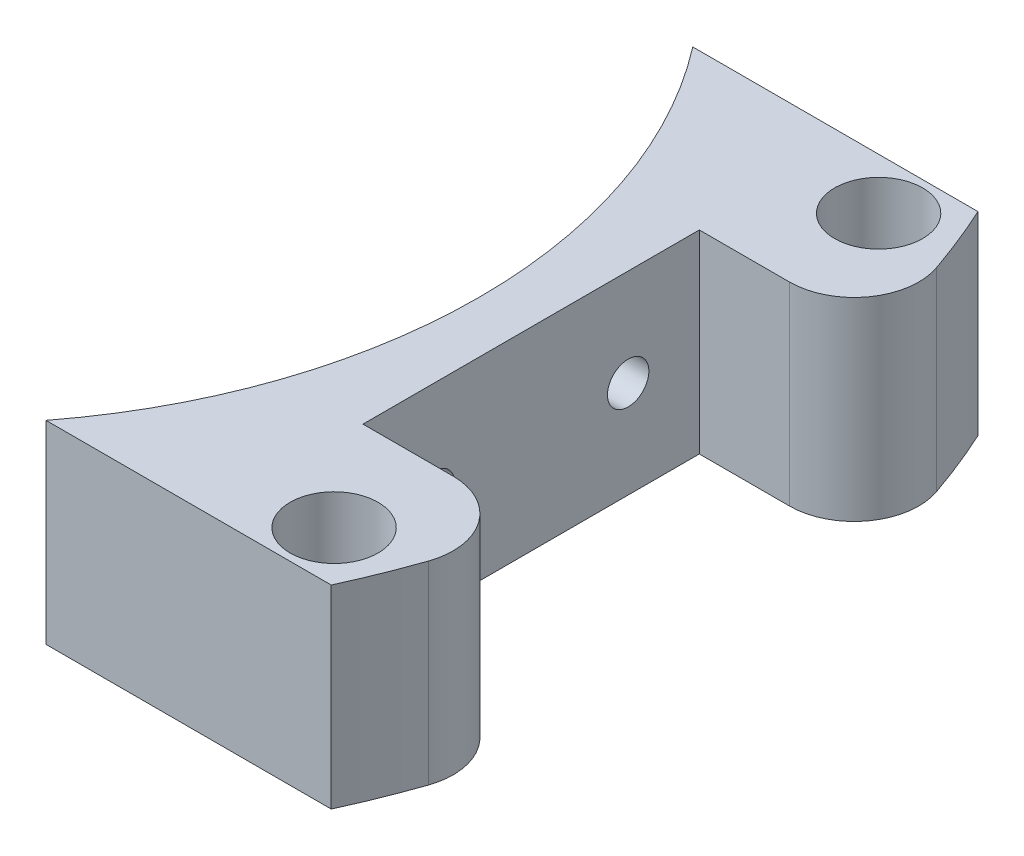
ISO-10303-21;
HEADER;
FILE_DESCRIPTION(('STEP AP214'),'2;1');
FILE_NAME('part.step','',(''),(''),'','','');
FILE_SCHEMA(('AUTOMOTIVE_DESIGN { 1 0 10303 214 1 1 1 1 }'));
ENDSEC;
DATA;
#1=APPLICATION_CONTEXT('core data for automotive mechanical design processes');
#2=APPLICATION_PROTOCOL_DEFINITION('international standard','automotive_design',2000,#1);
#3=PRODUCT_CONTEXT('',#1,'mechanical');
#4=PRODUCT('Part','Part','',(#3));
#5=PRODUCT_RELATED_PRODUCT_CATEGORY('part','',(#4));
#6=PRODUCT_DEFINITION_FORMATION('','',#4);
#7=PRODUCT_DEFINITION_CONTEXT('part definition',#1,'design');
#8=PRODUCT_DEFINITION('design','',#6,#7);
#9=PRODUCT_DEFINITION_SHAPE('','',#8);
#10=(LENGTH_UNIT() NAMED_UNIT(*) SI_UNIT(.MILLI.,.METRE.));
#11=(NAMED_UNIT(*) PLANE_ANGLE_UNIT() SI_UNIT($,.RADIAN.));
#12=(NAMED_UNIT(*) SI_UNIT($,.STERADIAN.) SOLID_ANGLE_UNIT());
#13=UNCERTAINTY_MEASURE_WITH_UNIT(LENGTH_MEASURE(1.E-05),#10,'distance_accuracy_value','');
#14=(GEOMETRIC_REPRESENTATION_CONTEXT(3) GLOBAL_UNCERTAINTY_ASSIGNED_CONTEXT((#13)) GLOBAL_UNIT_ASSIGNED_CONTEXT((#10,
#11,#12)) REPRESENTATION_CONTEXT('',''));
#15=CARTESIAN_POINT('',(0.,0.,0.));
#16=DIRECTION('',(0.,0.,1.));
#17=DIRECTION('',(1.,0.,0.));
#18=AXIS2_PLACEMENT_3D('',#15,#16,#17);
#19=CARTESIAN_POINT('',(-7.95357838980362,7.5,-68.2096969177125));
#20=DIRECTION('',(1.,0.,0.));
#21=DIRECTION('',(0.,0.,-1.));
#22=AXIS2_PLACEMENT_3D('',#19,#20,#21);
#23=CYLINDRICAL_SURFACE('',#22,1.6);
#24=CARTESIAN_POINT('',(4.55026799165255,7.5,-68.2096969177125));
#25=DIRECTION('',(1.,0.,0.));
#26=DIRECTION('',(0.,0.,-1.));
#27=AXIS2_PLACEMENT_3D('',#24,#25,#26);
#28=CIRCLE('',#27,1.6);
#29=CARTESIAN_POINT('',(4.55026799165255,7.5,-69.8096969177125));
#30=VERTEX_POINT('',#29);
#31=EDGE_CURVE('E377',#30,#30,#28,.T.);
#32=CARTESIAN_POINT('',(2.04642161019638,7.5,-68.2096969177125));
#33=DIRECTION('',(-1.,0.,0.));
#34=DIRECTION('',(0.,0.,1.));
#35=AXIS2_PLACEMENT_3D('',#32,#33,#34);
#36=CIRCLE('',#35,1.6);
#37=CARTESIAN_POINT('',(2.04642161019638,7.5,-69.8096969177125));
#38=VERTEX_POINT('',#37);
#39=EDGE_CURVE('E363',#38,#38,#36,.T.);
#40=CARTESIAN_POINT('',(4.55026799165255,7.5,-69.8096969177125));
#41=CARTESIAN_POINT('',(4.52418625851238,7.5,-69.8096969177125));
#42=CARTESIAN_POINT('',(4.49810452537221,7.5,-69.8096969177125));
#43=CARTESIAN_POINT('',(4.44594105909187,7.5,-69.8096969177125));
#44=CARTESIAN_POINT('',(4.4198593259517,7.5,-69.8096969177125));
#45=CARTESIAN_POINT('',(4.36769585967137,7.5,-69.8096969177125));
#46=CARTESIAN_POINT('',(4.3416141265312,7.5,-69.8096969177125));
#47=CARTESIAN_POINT('',(4.28945066025086,7.5,-69.8096969177125));
#48=CARTESIAN_POINT('',(4.26336892711069,7.5,-69.8096969177125));
#49=CARTESIAN_POINT('',(4.21120546083036,7.5,-69.8096969177125));
#50=CARTESIAN_POINT('',(4.18512372769019,7.5,-69.8096969177125));
#51=CARTESIAN_POINT('',(4.13296026140985,7.5,-69.8096969177125));
#52=CARTESIAN_POINT('',(4.10687852826968,7.5,-69.8096969177125));
#53=CARTESIAN_POINT('',(4.05471506198935,7.5,-69.8096969177125));
#54=CARTESIAN_POINT('',(4.02863332884918,7.5,-69.8096969177125));
#55=CARTESIAN_POINT('',(3.97646986256884,7.5,-69.8096969177125));
#56=CARTESIAN_POINT('',(3.95038812942867,7.5,-69.8096969177125));
#57=CARTESIAN_POINT('',(3.89822466314834,7.5,-69.8096969177125));
#58=CARTESIAN_POINT('',(3.87214293000817,7.5,-69.8096969177125));
#59=CARTESIAN_POINT('',(3.81997946372783,7.5,-69.8096969177125));
#60=CARTESIAN_POINT('',(3.79389773058766,7.5,-69.8096969177125));
#61=CARTESIAN_POINT('',(3.74173426430732,7.5,-69.8096969177125));
#62=CARTESIAN_POINT('',(3.71565253116716,7.5,-69.8096969177125));
#63=CARTESIAN_POINT('',(3.66348906488682,7.5,-69.8096969177125));
#64=CARTESIAN_POINT('',(3.63740733174665,7.5,-69.8096969177125));
#65=CARTESIAN_POINT('',(3.58524386546632,7.5,-69.8096969177125));
#66=CARTESIAN_POINT('',(3.55916213232615,7.5,-69.8096969177125));
#67=CARTESIAN_POINT('',(3.50699866604581,7.5,-69.8096969177125));
#68=CARTESIAN_POINT('',(3.48091693290564,7.5,-69.8096969177125));
#69=CARTESIAN_POINT('',(3.4287534666253,7.5,-69.8096969177125));
#70=CARTESIAN_POINT('',(3.40267173348514,7.5,-69.8096969177125));
#71=CARTESIAN_POINT('',(3.3505082672048,7.5,-69.8096969177125));
#72=CARTESIAN_POINT('',(3.32442653406463,7.5,-69.8096969177125));
#73=CARTESIAN_POINT('',(3.27226306778429,7.5,-69.8096969177125));
#74=CARTESIAN_POINT('',(3.24618133464413,7.5,-69.8096969177125));
#75=CARTESIAN_POINT('',(3.19401786836379,7.5,-69.8096969177125));
#76=CARTESIAN_POINT('',(3.16793613522362,7.5,-69.8096969177125));
#77=CARTESIAN_POINT('',(3.11577266894328,7.5,-69.8096969177125));
#78=CARTESIAN_POINT('',(3.08969093580311,7.5,-69.8096969177125));
#79=CARTESIAN_POINT('',(3.03752746952278,7.5,-69.8096969177125));
#80=CARTESIAN_POINT('',(3.01144573638261,7.5,-69.8096969177125));
#81=CARTESIAN_POINT('',(2.95928227010227,7.5,-69.8096969177125));
#82=CARTESIAN_POINT('',(2.9332005369621,7.5,-69.8096969177125));
#83=CARTESIAN_POINT('',(2.88103707068177,7.5,-69.8096969177125));
#84=CARTESIAN_POINT('',(2.8549553375416,7.5,-69.8096969177125));
#85=CARTESIAN_POINT('',(2.80279187126126,7.5,-69.8096969177125));
#86=CARTESIAN_POINT('',(2.77671013812109,7.5,-69.8096969177125));
#87=CARTESIAN_POINT('',(2.72454667184076,7.5,-69.8096969177125));
#88=CARTESIAN_POINT('',(2.69846493870059,7.5,-69.8096969177125));
#89=CARTESIAN_POINT('',(2.64630147242025,7.5,-69.8096969177125));
#90=CARTESIAN_POINT('',(2.62021973928008,7.5,-69.8096969177125));
#91=CARTESIAN_POINT('',(2.56805627299975,7.5,-69.8096969177125));
#92=CARTESIAN_POINT('',(2.54197453985958,7.5,-69.8096969177125));
#93=CARTESIAN_POINT('',(2.48981107357924,7.5,-69.8096969177125));
#94=CARTESIAN_POINT('',(2.46372934043907,7.5,-69.8096969177125));
#95=CARTESIAN_POINT('',(2.41156587415874,7.5,-69.8096969177125));
#96=CARTESIAN_POINT('',(2.38548414101857,7.5,-69.8096969177125));
#97=CARTESIAN_POINT('',(2.33332067473823,7.5,-69.8096969177125));
#98=CARTESIAN_POINT('',(2.30723894159806,7.5,-69.8096969177125));
#99=CARTESIAN_POINT('',(2.25507547531773,7.5,-69.8096969177125));
#100=CARTESIAN_POINT('',(2.22899374217756,7.5,-69.8096969177125));
#101=CARTESIAN_POINT('',(2.17683027589722,7.5,-69.8096969177125));
#102=CARTESIAN_POINT('',(2.15074854275705,7.5,-69.8096969177125));
#103=CARTESIAN_POINT('',(2.09858507647671,7.5,-69.8096969177125));
#104=CARTESIAN_POINT('',(2.07250334333655,7.5,-69.8096969177125));
#105=CARTESIAN_POINT('',(2.04642161019638,7.5,-69.8096969177125));
#106=B_SPLINE_CURVE_WITH_KNOTS('',3,(#40,#41,#42,#43,#44,#45,#46,#47,#48,#49,#50,#51,#52,#53,
#54,#55,#56,#57,#58,#59,#60,#61,#62,#63,#64,#65,#66,#67,#68,#69,#70,#71,#72,#73,#74,#75,#76,#77,
#78,#79,#80,#81,#82,#83,#84,#85,#86,#87,#88,#89,#90,#91,#92,#93,#94,#95,#96,#97,#98,#99,#100,
#101,#102,#103,#104,#105),.UNSPECIFIED.,.F.,.F.,(4,2,2,2,2,2,2,2,2,2,2,2,2,2,2,2,2,2,2,2,2,2,2,
2,2,2,2,2,2,2,2,2,4),(0.,0.0782451994205055,0.156490398841011,0.234735598261517,
0.312980797682022,0.391225997102526,0.469471196523031,0.547716395943537,0.625961595364042,
0.704206794784548,0.782451994205053,0.860697193625559,0.938942393046063,1.01718759246657,
1.09543279188707,1.17367799130758,1.25192319072808,1.33016839014859,1.4084135895691,
1.4866587889896,1.56490398841011,1.64314918783061,1.72139438725112,1.79963958667162,
1.87788478609213,1.95612998551263,2.03437518493314,2.11262038435364,2.19086558377415,
2.26911078319465,2.34735598261516,2.42560118203566,2.50384638145617),.UNSPECIFIED.);
#107=EDGE_CURVE('BSEAM49',#30,#38,#106,.T.);
#108=ORIENTED_EDGE('',*,*,#31,.T.);
#109=ORIENTED_EDGE('',*,*,#39,.T.);
#110=ORIENTED_EDGE('',*,*,#107,.T.);
#111=ORIENTED_EDGE('',*,*,#107,.F.);
#112=EDGE_LOOP('',(#108,#110,#109,#111));
#113=FACE_BOUND('',#112,.T.);
#114=ADVANCED_FACE('F49',(#113),#23,.F.);
#115=CARTESIAN_POINT('',(-7.95357838980362,7.5,-83.2096969177125));
#116=DIRECTION('',(1.,0.,0.));
#117=DIRECTION('',(0.,0.,-1.));
#118=AXIS2_PLACEMENT_3D('',#115,#116,#117);
#119=CYLINDRICAL_SURFACE('',#118,1.6);
#120=CARTESIAN_POINT('',(4.55026799165254,7.5,-83.2096969177125));
#121=DIRECTION('',(1.,0.,0.));
#122=DIRECTION('',(0.,0.,-1.));
#123=AXIS2_PLACEMENT_3D('',#120,#121,#122);
#124=CIRCLE('',#123,1.6);
#125=CARTESIAN_POINT('',(4.55026799165254,7.5,-84.8096969177125));
#126=VERTEX_POINT('',#125);
#127=EDGE_CURVE('E167',#126,#126,#124,.T.);
#128=CARTESIAN_POINT('',(2.04642161019638,7.5,-83.2096969177125));
#129=DIRECTION('',(-1.,0.,0.));
#130=DIRECTION('',(0.,0.,1.));
#131=AXIS2_PLACEMENT_3D('',#128,#129,#130);
#132=CIRCLE('',#131,1.6);
#133=CARTESIAN_POINT('',(2.04642161019638,7.5,-84.8096969177125));
#134=VERTEX_POINT('',#133);
#135=EDGE_CURVE('E366',#134,#134,#132,.T.);
#136=CARTESIAN_POINT('',(4.55026799165254,7.5,-84.8096969177125));
#137=CARTESIAN_POINT('',(4.52418625851238,7.5,-84.8096969177125));
#138=CARTESIAN_POINT('',(4.49810452537221,7.5,-84.8096969177125));
#139=CARTESIAN_POINT('',(4.44594105909187,7.5,-84.8096969177125));
#140=CARTESIAN_POINT('',(4.4198593259517,7.5,-84.8096969177125));
#141=CARTESIAN_POINT('',(4.36769585967137,7.5,-84.8096969177125));
#142=CARTESIAN_POINT('',(4.3416141265312,7.5,-84.8096969177125));
#143=CARTESIAN_POINT('',(4.28945066025086,7.5,-84.8096969177125));
#144=CARTESIAN_POINT('',(4.26336892711069,7.5,-84.8096969177125));
#145=CARTESIAN_POINT('',(4.21120546083036,7.5,-84.8096969177125));
#146=CARTESIAN_POINT('',(4.18512372769019,7.5,-84.8096969177125));
#147=CARTESIAN_POINT('',(4.13296026140985,7.5,-84.8096969177125));
#148=CARTESIAN_POINT('',(4.10687852826968,7.5,-84.8096969177125));
#149=CARTESIAN_POINT('',(4.05471506198935,7.5,-84.8096969177125));
#150=CARTESIAN_POINT('',(4.02863332884918,7.5,-84.8096969177125));
#151=CARTESIAN_POINT('',(3.97646986256884,7.5,-84.8096969177125));
#152=CARTESIAN_POINT('',(3.95038812942867,7.5,-84.8096969177125));
#153=CARTESIAN_POINT('',(3.89822466314834,7.5,-84.8096969177125));
#154=CARTESIAN_POINT('',(3.87214293000817,7.5,-84.8096969177125));
#155=CARTESIAN_POINT('',(3.81997946372783,7.5,-84.8096969177125));
#156=CARTESIAN_POINT('',(3.79389773058766,7.5,-84.8096969177125));
#157=CARTESIAN_POINT('',(3.74173426430732,7.5,-84.8096969177125));
#158=CARTESIAN_POINT('',(3.71565253116716,7.5,-84.8096969177125));
#159=CARTESIAN_POINT('',(3.66348906488682,7.5,-84.8096969177125));
#160=CARTESIAN_POINT('',(3.63740733174665,7.5,-84.8096969177125));
#161=CARTESIAN_POINT('',(3.58524386546631,7.5,-84.8096969177125));
#162=CARTESIAN_POINT('',(3.55916213232615,7.5,-84.8096969177125));
#163=CARTESIAN_POINT('',(3.50699866604581,7.5,-84.8096969177125));
#164=CARTESIAN_POINT('',(3.48091693290564,7.5,-84.8096969177125));
#165=CARTESIAN_POINT('',(3.4287534666253,7.5,-84.8096969177125));
#166=CARTESIAN_POINT('',(3.40267173348514,7.5,-84.8096969177125));
#167=CARTESIAN_POINT('',(3.3505082672048,7.5,-84.8096969177125));
#168=CARTESIAN_POINT('',(3.32442653406463,7.5,-84.8096969177125));
#169=CARTESIAN_POINT('',(3.27226306778429,7.5,-84.8096969177125));
#170=CARTESIAN_POINT('',(3.24618133464413,7.5,-84.8096969177125));
#171=CARTESIAN_POINT('',(3.19401786836379,7.5,-84.8096969177125));
#172=CARTESIAN_POINT('',(3.16793613522362,7.5,-84.8096969177125));
#173=CARTESIAN_POINT('',(3.11577266894328,7.5,-84.8096969177125));
#174=CARTESIAN_POINT('',(3.08969093580312,7.5,-84.8096969177125));
#175=CARTESIAN_POINT('',(3.03752746952278,7.5,-84.8096969177125));
#176=CARTESIAN_POINT('',(3.01144573638261,7.5,-84.8096969177125));
#177=CARTESIAN_POINT('',(2.95928227010227,7.5,-84.8096969177125));
#178=CARTESIAN_POINT('',(2.9332005369621,7.5,-84.8096969177125));
#179=CARTESIAN_POINT('',(2.88103707068177,7.5,-84.8096969177125));
#180=CARTESIAN_POINT('',(2.8549553375416,7.5,-84.8096969177125));
#181=CARTESIAN_POINT('',(2.80279187126126,7.5,-84.8096969177125));
#182=CARTESIAN_POINT('',(2.77671013812109,7.5,-84.8096969177125));
#183=CARTESIAN_POINT('',(2.72454667184076,7.5,-84.8096969177125));
#184=CARTESIAN_POINT('',(2.69846493870059,7.5,-84.8096969177125));
#185=CARTESIAN_POINT('',(2.64630147242025,7.5,-84.8096969177125));
#186=CARTESIAN_POINT('',(2.62021973928008,7.5,-84.8096969177125));
#187=CARTESIAN_POINT('',(2.56805627299975,7.5,-84.8096969177125));
#188=CARTESIAN_POINT('',(2.54197453985958,7.5,-84.8096969177125));
#189=CARTESIAN_POINT('',(2.48981107357924,7.5,-84.8096969177125));
#190=CARTESIAN_POINT('',(2.46372934043907,7.5,-84.8096969177125));
#191=CARTESIAN_POINT('',(2.41156587415874,7.5,-84.8096969177125));
#192=CARTESIAN_POINT('',(2.38548414101857,7.5,-84.8096969177125));
#193=CARTESIAN_POINT('',(2.33332067473823,7.5,-84.8096969177125));
#194=CARTESIAN_POINT('',(2.30723894159806,7.5,-84.8096969177125));
#195=CARTESIAN_POINT('',(2.25507547531773,7.5,-84.8096969177125));
#196=CARTESIAN_POINT('',(2.22899374217756,7.5,-84.8096969177125));
#197=CARTESIAN_POINT('',(2.17683027589722,7.5,-84.8096969177125));
#198=CARTESIAN_POINT('',(2.15074854275705,7.5,-84.8096969177125));
#199=CARTESIAN_POINT('',(2.09858507647672,7.5,-84.8096969177125));
#200=CARTESIAN_POINT('',(2.07250334333655,7.5,-84.8096969177125));
#201=CARTESIAN_POINT('',(2.04642161019638,7.5,-84.8096969177125));
#202=B_SPLINE_CURVE_WITH_KNOTS('',3,(#136,#137,#138,#139,#140,#141,#142,#143,#144,#145,#146,
#147,#148,#149,#150,#151,#152,#153,#154,#155,#156,#157,#158,#159,#160,#161,#162,#163,#164,#165,
#166,#167,#168,#169,#170,#171,#172,#173,#174,#175,#176,#177,#178,#179,#180,#181,#182,#183,#184,
#185,#186,#187,#188,#189,#190,#191,#192,#193,#194,#195,#196,#197,#198,#199,#200,#201),
.UNSPECIFIED.,.F.,.F.,(4,2,2,2,2,2,2,2,2,2,2,2,2,2,2,2,2,2,2,2,2,2,2,2,2,2,2,2,2,2,2,2,4),(0.,
0.0782451994205055,0.156490398841011,0.234735598261515,0.31298079768202,0.391225997102526,
0.469471196523031,0.547716395943537,0.625961595364041,0.704206794784546,0.782451994205052,
0.860697193625557,0.938942393046063,1.01718759246657,1.09543279188707,1.17367799130758,
1.25192319072808,1.33016839014859,1.40841358956909,1.4866587889896,1.5649039884101,
1.64314918783061,1.72139438725111,1.79963958667162,1.87788478609213,1.95612998551263,
2.03437518493313,2.11262038435364,2.19086558377415,2.26911078319465,2.34735598261515,
2.42560118203566,2.50384638145617),.UNSPECIFIED.);
#203=EDGE_CURVE('BSEAM271',#126,#134,#202,.T.);
#204=ORIENTED_EDGE('',*,*,#127,.T.);
#205=ORIENTED_EDGE('',*,*,#135,.T.);
#206=ORIENTED_EDGE('',*,*,#203,.T.);
#207=ORIENTED_EDGE('',*,*,#203,.F.);
#208=EDGE_LOOP('',(#204,#206,#205,#207));
#209=FACE_BOUND('',#208,.T.);
#210=ADVANCED_FACE('F271',(#209),#119,.F.);
#211=CARTESIAN_POINT('',(-40.4497320083475,15.,-75.7096969177125));
#212=DIRECTION('',(0.,-1.,0.));
#213=DIRECTION('',(0.,0.,-1.));
#214=AXIS2_PLACEMENT_3D('',#211,#212,#213);
#215=CYLINDRICAL_SURFACE('',#214,60.);
#216=CARTESIAN_POINT('',(-40.4497320083475,0.,-75.7096969177125));
#217=DIRECTION('',(0.,1.,0.));
#218=DIRECTION('',(0.,0.,1.));
#219=AXIS2_PLACEMENT_3D('',#216,#217,#218);
#220=CIRCLE('',#219,60.);
#221=CARTESIAN_POINT('',(14.0938285648311,0.,-50.7096969177125));
#222=VERTEX_POINT('',#221);
#223=CARTESIAN_POINT('',(16.2460634542836,0.,-56.0733332813489));
#224=VERTEX_POINT('',#223);
#225=EDGE_CURVE('E209',#222,#224,#220,.T.);
#226=ORIENTED_EDGE('',*,*,#225,.T.);
#227=DIRECTION('',(0.,-1.,0.));
#228=VECTOR('',#227,1.);
#229=CARTESIAN_POINT('',(16.2460634542836,15.,-56.0733332813489));
#230=LINE('',#229,#228);
#231=CARTESIAN_POINT('',(16.2460634542836,15.,-56.0733332813489));
#232=VERTEX_POINT('',#231);
#233=EDGE_CURVE('E58',#224,#232,#230,.F.);
#234=ORIENTED_EDGE('',*,*,#233,.T.);
#235=CARTESIAN_POINT('',(-40.4497320083475,15.,-75.7096969177125));
#236=DIRECTION('',(0.,1.,0.));
#237=DIRECTION('',(0.,0.,1.));
#238=AXIS2_PLACEMENT_3D('',#235,#236,#237);
#239=CIRCLE('',#238,60.);
#240=CARTESIAN_POINT('',(14.0938285648311,15.,-50.7096969177125));
#241=VERTEX_POINT('',#240);
#242=EDGE_CURVE('E185',#241,#232,#239,.T.);
#243=ORIENTED_EDGE('',*,*,#242,.F.);
#244=DIRECTION('',(0.,-1.,0.));
#245=VECTOR('',#244,1.);
#246=CARTESIAN_POINT('',(14.0938285648311,15.,-50.7096969177125));
#247=LINE('',#246,#245);
#248=EDGE_CURVE('E232',#241,#222,#247,.T.);
#249=ORIENTED_EDGE('',*,*,#248,.T.);
#250=EDGE_LOOP('',(#226,#234,#243,#249));
#251=FACE_BOUND('',#250,.T.);
#252=ADVANCED_FACE('F274',(#251),#215,.T.);
#253=CARTESIAN_POINT('',(0.,15.,-50.7096969177125));
#254=DIRECTION('',(0.,0.,-1.));
#255=DIRECTION('',(-1.,0.,0.));
#256=AXIS2_PLACEMENT_3D('',#253,#254,#255);
#257=PLANE('',#256);
#258=DIRECTION('',(1.,0.,0.));
#259=VECTOR('',#258,1.);
#260=CARTESIAN_POINT('',(0.,0.,-50.7096969177125));
#261=LINE('',#260,#259);
#262=CARTESIAN_POINT('',(-7.95357838980362,0.,-50.7096969177125));
#263=VERTEX_POINT('',#262);
#264=EDGE_CURVE('E204',#263,#222,#261,.T.);
#265=ORIENTED_EDGE('',*,*,#264,.T.);
#266=ORIENTED_EDGE('',*,*,#248,.F.);
#267=DIRECTION('',(1.,0.,0.));
#268=VECTOR('',#267,1.);
#269=CARTESIAN_POINT('',(0.,15.,-50.7096969177125));
#270=LINE('',#269,#268);
#271=CARTESIAN_POINT('',(-7.95357838980362,15.,-50.7096969177125));
#272=VERTEX_POINT('',#271);
#273=EDGE_CURVE('E179',#272,#241,#270,.T.);
#274=ORIENTED_EDGE('',*,*,#273,.F.);
#275=DIRECTION('',(0.,-1.,0.));
#276=VECTOR('',#275,1.);
#277=CARTESIAN_POINT('',(-7.95357838980362,15.,-50.7096969177125));
#278=LINE('',#277,#276);
#279=EDGE_CURVE('E201',#272,#263,#278,.T.);
#280=ORIENTED_EDGE('',*,*,#279,.T.);
#281=EDGE_LOOP('',(#265,#266,#274,#280));
#282=FACE_BOUND('',#281,.T.);
#283=ADVANCED_FACE('F313',(#282),#257,.F.);
#284=CARTESIAN_POINT('',(16.2460634542836,15.,-95.3460605540761));
#285=VERTEX_POINT('',#284);
#286=CARTESIAN_POINT('',(14.0938285648311,15.,-100.709696917713));
#287=VERTEX_POINT('',#286);
#288=EDGE_CURVE('E184',#285,#287,#239,.T.);
#289=ORIENTED_EDGE('',*,*,#288,.F.);
#290=DIRECTION('',(0.,-1.,0.));
#291=VECTOR('',#290,1.);
#292=CARTESIAN_POINT('',(16.2460634542836,15.,-95.3460605540761));
#293=LINE('',#292,#291);
#294=CARTESIAN_POINT('',(16.2460634542836,0.,-95.3460605540761));
#295=VERTEX_POINT('',#294);
#296=EDGE_CURVE('E322',#285,#295,#293,.T.);
#297=ORIENTED_EDGE('',*,*,#296,.T.);
#298=CARTESIAN_POINT('',(14.0938285648311,0.,-100.709696917713));
#299=VERTEX_POINT('',#298);
#300=EDGE_CURVE('E208',#295,#299,#220,.T.);
#301=ORIENTED_EDGE('',*,*,#300,.T.);
#302=DIRECTION('',(0.,-1.,0.));
#303=VECTOR('',#302,1.);
#304=CARTESIAN_POINT('',(14.0938285648311,15.,-100.709696917713));
#305=LINE('',#304,#303);
#306=EDGE_CURVE('E228',#287,#299,#305,.T.);
#307=ORIENTED_EDGE('',*,*,#306,.F.);
#308=EDGE_LOOP('',(#289,#297,#301,#307));
#309=FACE_BOUND('',#308,.T.);
#310=ADVANCED_FACE('F532',(#309),#215,.T.);
#311=CARTESIAN_POINT('',(0.,15.,-100.709696917713));
#312=DIRECTION('',(0.,0.,-1.));
#313=DIRECTION('',(-1.,0.,0.));
#314=AXIS2_PLACEMENT_3D('',#311,#312,#313);
#315=PLANE('',#314);
#316=DIRECTION('',(1.,0.,0.));
#317=VECTOR('',#316,1.);
#318=CARTESIAN_POINT('',(0.,0.,-100.709696917713));
#319=LINE('',#318,#317);
#320=CARTESIAN_POINT('',(-7.95357838980362,0.,-100.709696917713));
#321=VERTEX_POINT('',#320);
#322=EDGE_CURVE('E212',#321,#299,#319,.T.);
#323=ORIENTED_EDGE('',*,*,#322,.F.);
#324=DIRECTION('',(0.,-1.,0.));
#325=VECTOR('',#324,1.);
#326=CARTESIAN_POINT('',(-7.95357838980362,15.,-100.709696917713));
#327=LINE('',#326,#325);
#328=CARTESIAN_POINT('',(-7.95357838980362,15.,-100.709696917713));
#329=VERTEX_POINT('',#328);
#330=EDGE_CURVE('E225',#329,#321,#327,.T.);
#331=ORIENTED_EDGE('',*,*,#330,.F.);
#332=DIRECTION('',(1.,0.,0.));
#333=VECTOR('',#332,1.);
#334=CARTESIAN_POINT('',(0.,15.,-100.709696917713));
#335=LINE('',#334,#333);
#336=EDGE_CURVE('E189',#329,#287,#335,.T.);
#337=ORIENTED_EDGE('',*,*,#336,.T.);
#338=ORIENTED_EDGE('',*,*,#306,.T.);
#339=EDGE_LOOP('',(#323,#331,#337,#338));
#340=FACE_BOUND('',#339,.T.);
#341=ADVANCED_FACE('F309',(#340),#315,.T.);
#342=CARTESIAN_POINT('',(-40.4497320083475,15.,-75.7096969177125));
#343=DIRECTION('',(0.,-1.,0.));
#344=DIRECTION('',(0.,0.,-1.));
#345=AXIS2_PLACEMENT_3D('',#342,#343,#344);
#346=CYLINDRICAL_SURFACE('',#345,41.);
#347=CARTESIAN_POINT('',(0.244247890404163,7.5,-80.7096969177125));
#348=CARTESIAN_POINT('',(0.244247769142894,7.63953958054519,-80.7097031249828));
#349=CARTESIAN_POINT('',(0.242812809815982,7.77917745652285,-80.7214199569895));
#350=CARTESIAN_POINT('',(0.237050661624195,8.05459546747496,-80.7679817094588));
#351=CARTESIAN_POINT('',(0.232720097985835,8.19037090812802,-80.8028536164053));
#352=CARTESIAN_POINT('',(0.221118240002904,8.45402984623513,-80.8946818798937));
#353=CARTESIAN_POINT('',(0.213848583662864,8.58191769389263,-80.9516259345376));
#354=CARTESIAN_POINT('',(0.196314076156605,8.8262318798513,-81.085894371233));
#355=CARTESIAN_POINT('',(0.186049944516346,8.9426609625386,-81.1632138569531));
#356=CARTESIAN_POINT('',(0.162466385639141,9.16110267520519,-81.3361479157599));
#357=CARTESIAN_POINT('',(0.149140169834286,9.26308244696342,-81.4318030592615));
#358=CARTESIAN_POINT('',(0.11947293779966,9.44952680125989,-81.638481555741));
#359=CARTESIAN_POINT('',(0.103131739564697,9.53399032574215,-81.7495058364052));
#360=CARTESIAN_POINT('',(0.0674354222636683,9.68368371364481,-81.9845152807164));
#361=CARTESIAN_POINT('',(0.0480599939337971,9.74877471082223,-82.1085857816976));
#362=CARTESIAN_POINT('',(0.00663736843620957,9.85726413246985,-82.3654530284055));
#363=CARTESIAN_POINT('',(-0.0154099796495138,9.90066133089936,-82.4982502668502));
#364=CARTESIAN_POINT('',(-0.0620508350650094,9.96513250737867,-82.770468492487));
#365=CARTESIAN_POINT('',(-0.086671902822933,9.98593025461854,-82.9099501500508));
#366=CARTESIAN_POINT('',(-0.137653355635523,10.0038619751576,-83.1901107798907));
#367=CARTESIAN_POINT('',(-0.164013886772162,10.0009939584656,-83.3307898518606));
#368=CARTESIAN_POINT('',(-0.218123218502961,9.97159002427719,-83.6114926045368));
#369=CARTESIAN_POINT('',(-0.245886479053828,9.94471631036925,-83.7514781591905));
#370=CARTESIAN_POINT('',(-0.301535653523857,9.86763487005167,-84.0248519742309));
#371=CARTESIAN_POINT('',(-0.329421576452153,9.81742540037725,-84.1582397409154));
#372=CARTESIAN_POINT('',(-0.384511360201439,9.6945211584914,-84.41576300179));
#373=CARTESIAN_POINT('',(-0.411707880383471,9.62164781074766,-84.5398149385218));
#374=CARTESIAN_POINT('',(-0.464050035130434,9.45547720091905,-84.7738925701765));
#375=CARTESIAN_POINT('',(-0.48919569748685,9.36218021566115,-84.8839184551799));
#376=CARTESIAN_POINT('',(-0.536095570921726,9.15844707772272,-85.0858534906324));
#377=CARTESIAN_POINT('',(-0.557874619163438,9.04814975192513,-85.1778967857763));
#378=CARTESIAN_POINT('',(-0.597186171397107,8.8129118527767,-85.3420246372252));
#379=CARTESIAN_POINT('',(-0.614719281569794,8.68797337348635,-85.4141120427875));
#380=CARTESIAN_POINT('',(-0.644230550144819,8.43019238772488,-85.534452324158));
#381=CARTESIAN_POINT('',(-0.65633217539577,8.29761227165931,-85.5832367743809));
#382=CARTESIAN_POINT('',(-0.674917481824364,8.02576876025378,-85.6578437625486));
#383=CARTESIAN_POINT('',(-0.681402141338231,7.88650653323334,-85.6836702992135));
#384=CARTESIAN_POINT('',(-0.688292360379472,7.60909207965994,-85.7111024072051));
#385=CARTESIAN_POINT('',(-0.688849703465669,7.47100313252058,-85.7133127367343));
#386=CARTESIAN_POINT('',(-0.684249287046248,7.19644367728592,-85.6950096786649));
#387=CARTESIAN_POINT('',(-0.679091914546138,7.05997306022844,-85.674497829832));
#388=CARTESIAN_POINT('',(-0.663412292376216,6.79365875126292,-85.6117061708288));
#389=CARTESIAN_POINT('',(-0.652934403913531,6.66376987678888,-85.5696063281505));
#390=CARTESIAN_POINT('',(-0.627186072808716,6.41295871151837,-85.4650910809784));
#391=CARTESIAN_POINT('',(-0.61191533164036,6.29203697982689,-85.4026744110277));
#392=CARTESIAN_POINT('',(-0.577070791044258,6.06056548194694,-85.2583335596077));
#393=CARTESIAN_POINT('',(-0.557435428527176,5.95020015496325,-85.1761287307944));
#394=CARTESIAN_POINT('',(-0.514921888235395,5.7447446280778,-84.9951459682384));
#395=CARTESIAN_POINT('',(-0.492043269171666,5.6496565106098,-84.8963657788565));
#396=CARTESIAN_POINT('',(-0.443380572577507,5.47475198204149,-84.6821108007337));
#397=CARTESIAN_POINT('',(-0.417534899109659,5.39541511719108,-84.5662584443235));
#398=CARTESIAN_POINT('',(-0.364526792661922,5.25729073206082,-84.3231624290585));
#399=CARTESIAN_POINT('',(-0.337364200461988,5.1985057036596,-84.1959173912064));
#400=CARTESIAN_POINT('',(-0.282169738403813,5.10200058885098,-83.9307453257172));
#401=CARTESIAN_POINT('',(-0.254131498494418,5.06474035516384,-83.7926520226399));
#402=CARTESIAN_POINT('',(-0.198714264081541,5.0142528678512,-83.5120057852935));
#403=CARTESIAN_POINT('',(-0.17133529519368,5.00102654656844,-83.3694526782344));
#404=CARTESIAN_POINT('',(-0.117977187697763,4.99908506266931,-83.0833529443416));
#405=CARTESIAN_POINT('',(-0.0920036932695396,5.01046215312345,-82.9398045969288));
#406=CARTESIAN_POINT('',(-0.042259630067801,5.05776510959252,-82.6564138816231));
#407=CARTESIAN_POINT('',(-0.0184889563768863,5.09368980575475,-82.5165713374546));
#408=CARTESIAN_POINT('',(0.0261015222763756,5.18873566491826,-82.2461714224278));
#409=CARTESIAN_POINT('',(0.0469493850675516,5.24761228538402,-82.1155327673731));
#410=CARTESIAN_POINT('',(0.08564996451157,5.3870328134005,-81.8658954022403));
#411=CARTESIAN_POINT('',(0.103503027157805,5.46757421518607,-81.7468953482018));
#412=CARTESIAN_POINT('',(0.135798047752012,5.64677208188605,-81.5258018778509));
#413=CARTESIAN_POINT('',(0.150285852630905,5.74514795793067,-81.4234876863006));
#414=CARTESIAN_POINT('',(0.176125658904497,5.95804493978426,-81.2367755410243));
#415=CARTESIAN_POINT('',(0.187477087706344,6.07256898792969,-81.1523808594259));
#416=CARTESIAN_POINT('',(0.206957040135813,6.31317050502518,-81.0048956661991));
#417=CARTESIAN_POINT('',(0.215118004718072,6.43911472881001,-80.9415917342512));
#418=CARTESIAN_POINT('',(0.228433300433958,6.69987775354572,-80.8370423461793));
#419=CARTESIAN_POINT('',(0.233591270720114,6.83468559167947,-80.7957701960965));
#420=CARTESIAN_POINT('',(0.239605813761924,7.05862007205775,-80.7473668516601));
#421=CARTESIAN_POINT('',(0.241347007893371,7.14627772450408,-80.7332593857805));
#422=CARTESIAN_POINT('',(0.243668083069101,7.32261034294006,-80.7144224592836));
#423=CARTESIAN_POINT('',(0.244247967498106,7.41128530596392,-80.7096929713334));
#424=CARTESIAN_POINT('',(0.244247890404163,7.5,-80.7096969177125));
#425=B_SPLINE_CURVE_WITH_KNOTS('',3,(#347,#348,#349,#350,#351,#352,#353,#354,#355,#356,#357,
#358,#359,#360,#361,#362,#363,#364,#365,#366,#367,#368,#369,#370,#371,#372,#373,#374,#375,#376,
#377,#378,#379,#380,#381,#382,#383,#384,#385,#386,#387,#388,#389,#390,#391,#392,#393,#394,#395,
#396,#397,#398,#399,#400,#401,#402,#403,#404,#405,#406,#407,#408,#409,#410,#411,#412,#413,#414,
#415,#416,#417,#418,#419,#420,#421,#422,#423,#424),.UNSPECIFIED.,.T.,.F.,(4,2,2,2,2,2,2,2,2,2,2,
2,2,2,2,2,2,2,2,2,2,2,2,2,2,2,2,2,2,2,2,2,2,2,2,2,2,2,4),(0.,0.418294489317391,
0.837077344897871,1.25562712695491,1.67407642070838,2.09346251347098,2.5128739315669,
2.93522311752563,3.35759617015574,3.78507570918829,4.21259119420666,4.64621891648357,
5.0798790375169,5.51704657950311,5.95420819638101,6.38797252795521,6.82167489564912,
7.24494566711783,7.66814270047528,8.08047581515256,8.49278100797924,8.90170360098343,
9.31065166907715,9.72578217599281,10.1409692213543,10.5673233856256,10.9937292267712,
11.4289366168773,11.8641608895364,12.3010199099733,12.737858112695,13.1701638958212,
13.6024196996141,14.0283869445052,14.4544319048464,14.8760245241194,15.2971051708584,
15.5630438790642,15.8289818121709),.UNSPECIFIED.);
#426=CARTESIAN_POINT('',(0.244247890404163,7.5,-80.7096969177125));
#427=VERTEX_POINT('',#426);
#428=EDGE_CURVE('E246',#427,#427,#425,.T.);
#429=ORIENTED_EDGE('',*,*,#428,.F.);
#430=EDGE_LOOP('',(#429));
#431=FACE_BOUND('',#430,.T.);
#432=CARTESIAN_POINT('',(-0.687941304205367,7.5,-65.7096969177125));
#433=CARTESIAN_POINT('',(-0.687939007102996,7.63750819063922,-65.7097034743755));
#434=CARTESIAN_POINT('',(-0.68507164593307,7.77511499329927,-65.7210858347979));
#435=CARTESIAN_POINT('',(-0.673749640530785,8.04646727809896,-65.7662696135609));
#436=CARTESIAN_POINT('',(-0.665288384637071,8.1802079952767,-65.8000975614652));
#437=CARTESIAN_POINT('',(-0.643247305676637,8.43979452868189,-65.889011730132));
#438=CARTESIAN_POINT('',(-0.62967368777906,8.56564970092012,-65.9440721817023));
#439=CARTESIAN_POINT('',(-0.598106771242214,8.80621576837834,-66.0737021570263));
#440=CARTESIAN_POINT('',(-0.580114184665767,8.92092845492198,-66.1482685377637));
#441=CARTESIAN_POINT('',(-0.540268676062211,9.13794199920736,-66.3159621245002));
#442=CARTESIAN_POINT('',(-0.518361610526904,9.24002949836632,-66.4093523754941));
#443=CARTESIAN_POINT('',(-0.471866899915871,9.4271879481531,-66.6112893062361));
#444=CARTESIAN_POINT('',(-0.447278818010274,9.51225611932618,-66.7198384567022));
#445=CARTESIAN_POINT('',(-0.39575261010802,9.66532795056857,-66.9522285423949));
#446=CARTESIAN_POINT('',(-0.368769108501823,9.7328120373517,-67.0764018343384));
#447=CARTESIAN_POINT('',(-0.314107238027987,9.84591572695552,-67.3341983179742));
#448=CARTESIAN_POINT('',(-0.286428797608685,9.89153306855643,-67.4678224853338));
#449=CARTESIAN_POINT('',(-0.230917098579888,9.9602254904132,-67.7430831155686));
#450=CARTESIAN_POINT('',(-0.203088429143811,9.98292885467686,-67.8848134679345));
#451=CARTESIAN_POINT('',(-0.148632274341768,10.0037836227772,-68.1703020847514));
#452=CARTESIAN_POINT('',(-0.122004793754917,10.0019349289384,-68.3140603572679));
#453=CARTESIAN_POINT('',(-0.0707396375653686,9.97360634466763,-68.5992859874736));
#454=CARTESIAN_POINT('',(-0.046099184135363,9.9471615114358,-68.7407563142837));
#455=CARTESIAN_POINT('',(0.00065246278973205,9.87026163097694,-69.017455756568));
#456=CARTESIAN_POINT('',(0.0227638169874016,9.81980811034865,-69.1526852682665));
#457=CARTESIAN_POINT('',(0.0637884994824433,9.69697577813515,-69.4111587651676));
#458=CARTESIAN_POINT('',(0.0827390277018103,9.62488488830932,-69.5345336460028));
#459=CARTESIAN_POINT('',(0.117547162875251,9.4605050715594,-69.7674959410365));
#460=CARTESIAN_POINT('',(0.133405004966736,9.36821768131148,-69.8770844031936));
#461=CARTESIAN_POINT('',(0.161729426207271,9.16745638327454,-70.0777037208179));
#462=CARTESIAN_POINT('',(0.174240025314589,9.05922495131389,-70.1689710658355));
#463=CARTESIAN_POINT('',(0.196152035047275,8.8287121278054,-70.3320669759558));
#464=CARTESIAN_POINT('',(0.205553608652083,8.70643147319028,-70.403896559977));
#465=CARTESIAN_POINT('',(0.221221353388235,8.45252325017155,-70.5253660300552));
#466=CARTESIAN_POINT('',(0.227515796969393,8.32099289510708,-70.575205548969));
#467=CARTESIAN_POINT('',(0.237157075788744,8.05134373936052,-70.6521704163922));
#468=CARTESIAN_POINT('',(0.240503992049314,7.91322511988833,-70.6792963892563));
#469=CARTESIAN_POINT('',(0.244282567167139,7.63496881975542,-70.7099549664374));
#470=CARTESIAN_POINT('',(0.244726918569811,7.49484261879947,-70.7135902916034));
#471=CARTESIAN_POINT('',(0.242740018496925,7.21596904450375,-70.6974335487332));
#472=CARTESIAN_POINT('',(0.240308800547543,7.07722165510746,-70.677641753833));
#473=CARTESIAN_POINT('',(0.232544140088674,6.80518603249144,-70.6152505623801));
#474=CARTESIAN_POINT('',(0.2272136050198,6.6718924738993,-70.5726740151073));
#475=CARTESIAN_POINT('',(0.21359814361699,6.41438415185391,-70.4659906336454));
#476=CARTESIAN_POINT('',(0.205313221143266,6.29016937653854,-70.4018838275879));
#477=CARTESIAN_POINT('',(0.185719222091887,6.05409069492553,-70.2539053496312));
#478=CARTESIAN_POINT('',(0.174404822027489,5.94224902468123,-70.1699989163549));
#479=CARTESIAN_POINT('',(0.148742343657188,5.73426888667595,-69.9849627214954));
#480=CARTESIAN_POINT('',(0.134394216522659,5.63813067171032,-69.8838326826989));
#481=CARTESIAN_POINT('',(0.102634775251737,5.46368072171768,-69.6667152786296));
#482=CARTESIAN_POINT('',(0.0852071422399236,5.38546932569442,-69.5506497049266));
#483=CARTESIAN_POINT('',(0.047511313324494,5.24960495568032,-69.3074781199267));
#484=CARTESIAN_POINT('',(0.0272429893982197,5.19195290866192,-69.1803716111413));
#485=CARTESIAN_POINT('',(-0.0160558179282986,5.09814640818186,-68.9173659502801));
#486=CARTESIAN_POINT('',(-0.0391130331388461,5.06222368303875,-68.7813885840442));
#487=CARTESIAN_POINT('',(-0.0873471735782073,5.01364250709829,-68.5057069416982));
#488=CARTESIAN_POINT('',(-0.112524271581441,5.00098595446075,-68.3660023624485));
#489=CARTESIAN_POINT('',(-0.164740460873324,4.99911183101087,-68.0847246479669));
#490=CARTESIAN_POINT('',(-0.191800961338494,5.01023059243641,-67.9431532329847));
#491=CARTESIAN_POINT('',(-0.246649605045535,5.05617544790289,-67.6640518054567));
#492=CARTESIAN_POINT('',(-0.274437810005528,5.09100355908498,-67.5265221378127));
#493=CARTESIAN_POINT('',(-0.330114279993303,5.18391500623139,-67.2577545871751));
#494=CARTESIAN_POINT('',(-0.358000113870434,5.24225725503137,-67.1266056035905));
#495=CARTESIAN_POINT('',(-0.412472313256811,5.38063095193837,-66.875994415363));
#496=CARTESIAN_POINT('',(-0.439058693955367,5.46066214645167,-66.7565320740984));
#497=CARTESIAN_POINT('',(-0.489740849918785,5.64013231888339,-66.5329741792673));
#498=CARTESIAN_POINT('',(-0.513841351472322,5.73953338930393,-66.4288492976078));
#499=CARTESIAN_POINT('',(-0.558474346697436,5.95521028061272,-66.2388408461227));
#500=CARTESIAN_POINT('',(-0.579006323320453,6.07148854238923,-66.1529599192891));
#501=CARTESIAN_POINT('',(-0.615081822347885,6.31526144421815,-66.0036963470683));
#502=CARTESIAN_POINT('',(-0.630713312161498,6.44249876790909,-65.9399145001186));
#503=CARTESIAN_POINT('',(-0.656651246955649,6.70631022350114,-65.8347950642186));
#504=CARTESIAN_POINT('',(-0.666965226073576,6.84287083305607,-65.7934257157753));
#505=CARTESIAN_POINT('',(-0.678840245345902,7.0670206803307,-65.7459382877288));
#506=CARTESIAN_POINT('',(-0.682245325192358,7.15300563252428,-65.7323680707665));
#507=CARTESIAN_POINT('',(-0.686796560889656,7.32598056850039,-65.7142453933453));
#508=CARTESIAN_POINT('',(-0.687942758050349,7.41297053387425,-65.7096927679751));
#509=CARTESIAN_POINT('',(-0.687941304205367,7.5,-65.7096969177125));
#510=B_SPLINE_CURVE_WITH_KNOTS('',3,(#432,#433,#434,#435,#436,#437,#438,#439,#440,#441,#442,
#443,#444,#445,#446,#447,#448,#449,#450,#451,#452,#453,#454,#455,#456,#457,#458,#459,#460,#461,
#462,#463,#464,#465,#466,#467,#468,#469,#470,#471,#472,#473,#474,#475,#476,#477,#478,#479,#480,
#481,#482,#483,#484,#485,#486,#487,#488,#489,#490,#491,#492,#493,#494,#495,#496,#497,#498,#499,
#500,#501,#502,#503,#504,#505,#506,#507,#508,#509),.UNSPECIFIED.,.T.,.F.,(4,2,2,2,2,2,2,2,2,2,2,
2,2,2,2,2,2,2,2,2,2,2,2,2,2,2,2,2,2,2,2,2,2,2,2,2,2,2,4),(0.,0.412201299784934,
0.824890670863085,1.23708074283211,1.64920443893392,2.06754560374532,2.485955032879,
2.91559998537855,3.34528935748354,3.78184233325304,4.21839704576306,4.65433048308171,
5.09023620516053,5.52058089083453,5.95089284456821,6.37523143966449,6.799547786814,
7.21992854709184,7.6402977514763,8.05882749736698,8.47735236368022,8.89545830420295,
9.31356369842911,9.73240867707161,10.1512603976464,10.5724021636347,10.9935629155096,
11.4191393163928,11.8447504361869,12.2764221630328,12.7081306201834,13.1447284507077,
13.5813211766182,14.0170679047509,14.4528777162972,14.8803450835899,15.307205115888,
15.5680936851866,15.8289774833797),.UNSPECIFIED.);
#511=CARTESIAN_POINT('',(-0.687941304205367,7.5,-65.7096969177125));
#512=VERTEX_POINT('',#511);
#513=EDGE_CURVE('E237',#512,#512,#510,.T.);
#514=ORIENTED_EDGE('',*,*,#513,.F.);
#515=EDGE_LOOP('',(#514));
#516=FACE_BOUND('',#515,.T.);
#517=CARTESIAN_POINT('',(-40.4497320083475,0.,-75.7096969177125));
#518=DIRECTION('',(0.,1.,0.));
#519=DIRECTION('',(0.,0.,1.));
#520=AXIS2_PLACEMENT_3D('',#517,#518,#519);
#521=CIRCLE('',#520,41.);
#522=EDGE_CURVE('E216',#263,#321,#521,.T.);
#523=ORIENTED_EDGE('',*,*,#522,.F.);
#524=ORIENTED_EDGE('',*,*,#279,.F.);
#525=CARTESIAN_POINT('',(-40.4497320083475,15.,-75.7096969177125));
#526=DIRECTION('',(0.,1.,0.));
#527=DIRECTION('',(0.,0.,1.));
#528=AXIS2_PLACEMENT_3D('',#525,#526,#527);
#529=CIRCLE('',#528,41.);
#530=EDGE_CURVE('E193',#272,#329,#529,.T.);
#531=ORIENTED_EDGE('',*,*,#530,.T.);
#532=ORIENTED_EDGE('',*,*,#330,.T.);
#533=EDGE_LOOP('',(#523,#524,#531,#532));
#534=FACE_BOUND('',#533,.T.);
#535=ADVANCED_FACE('F253',(#431,#516,#534),#346,.F.);
#536=CARTESIAN_POINT('',(10.3636422797733,15.,-54.6621081376325));
#537=DIRECTION('',(0.,-1.,0.));
#538=DIRECTION('',(0.,0.,-1.));
#539=AXIS2_PLACEMENT_3D('',#536,#537,#538);
#540=CYLINDRICAL_SURFACE('',#539,3.4);
#541=CARTESIAN_POINT('',(10.3636422797733,15.,-54.6621081376325));
#542=DIRECTION('',(0.,1.,0.));
#543=DIRECTION('',(0.,0.,1.));
#544=AXIS2_PLACEMENT_3D('',#541,#542,#543);
#545=CIRCLE('',#544,3.4);
#546=CARTESIAN_POINT('',(10.3636422797733,15.,-51.2621081376325));
#547=VERTEX_POINT('',#546);
#548=EDGE_CURVE('E175',#547,#547,#545,.T.);
#549=ORIENTED_EDGE('',*,*,#548,.T.);
#550=EDGE_LOOP('',(#549));
#551=FACE_BOUND('',#550,.T.);
#552=CARTESIAN_POINT('',(10.3636422797733,0.,-54.6621081376325));
#553=DIRECTION('',(0.,1.,0.));
#554=DIRECTION('',(0.,0.,1.));
#555=AXIS2_PLACEMENT_3D('',#552,#553,#554);
#556=CIRCLE('',#555,3.4);
#557=CARTESIAN_POINT('',(10.3636422797733,0.,-51.2621081376325));
#558=VERTEX_POINT('',#557);
#559=EDGE_CURVE('E173',#558,#558,#556,.T.);
#560=ORIENTED_EDGE('',*,*,#559,.F.);
#561=EDGE_LOOP('',(#560));
#562=FACE_BOUND('',#561,.T.);
#563=ADVANCED_FACE('F295',(#551,#562),#540,.F.);
#564=CARTESIAN_POINT('',(10.3636422797733,15.,-96.7572856977924));
#565=DIRECTION('',(0.,-1.,0.));
#566=DIRECTION('',(0.,0.,-1.));
#567=AXIS2_PLACEMENT_3D('',#564,#565,#566);
#568=CYLINDRICAL_SURFACE('',#567,3.4);
#569=CARTESIAN_POINT('',(10.3636422797733,15.,-96.7572856977924));
#570=DIRECTION('',(0.,1.,0.));
#571=DIRECTION('',(0.,0.,1.));
#572=AXIS2_PLACEMENT_3D('',#569,#570,#571);
#573=CIRCLE('',#572,3.4);
#574=CARTESIAN_POINT('',(10.3636422797733,15.,-93.3572856977924));
#575=VERTEX_POINT('',#574);
#576=EDGE_CURVE('E197',#575,#575,#573,.T.);
#577=ORIENTED_EDGE('',*,*,#576,.T.);
#578=EDGE_LOOP('',(#577));
#579=FACE_BOUND('',#578,.T.);
#580=CARTESIAN_POINT('',(10.3636422797733,0.,-96.7572856977924));
#581=DIRECTION('',(0.,1.,0.));
#582=DIRECTION('',(0.,0.,1.));
#583=AXIS2_PLACEMENT_3D('',#580,#581,#582);
#584=CIRCLE('',#583,3.4);
#585=CARTESIAN_POINT('',(10.3636422797733,0.,-93.3572856977924));
#586=VERTEX_POINT('',#585);
#587=EDGE_CURVE('E180',#586,#586,#584,.T.);
#588=ORIENTED_EDGE('',*,*,#587,.F.);
#589=EDGE_LOOP('',(#588));
#590=FACE_BOUND('',#589,.T.);
#591=ADVANCED_FACE('F290',(#579,#590),#568,.F.);
#592=CARTESIAN_POINT('',(0.,15.,0.));
#593=DIRECTION('',(0.,1.,0.));
#594=DIRECTION('',(0.,0.,1.));
#595=AXIS2_PLACEMENT_3D('',#592,#593,#594);
#596=PLANE('',#595);
#597=DIRECTION('',(-1.,0.,0.));
#598=VECTOR('',#597,1.);
#599=CARTESIAN_POINT('',(0.,15.,-88.7096969177125));
#600=LINE('',#599,#598);
#601=CARTESIAN_POINT('',(11.5214138323977,15.,-88.7096969177125));
#602=VERTEX_POINT('',#601);
#603=CARTESIAN_POINT('',(4.55026799165254,15.,-88.7096969177125));
#604=VERTEX_POINT('',#603);
#605=EDGE_CURVE('E144',#602,#604,#600,.T.);
#606=ORIENTED_EDGE('',*,*,#605,.F.);
#607=CARTESIAN_POINT('',(11.5214138323977,15.,-93.7096969177125));
#608=DIRECTION('',(0.,1.,0.));
#609=DIRECTION('',(0.,0.,1.));
#610=AXIS2_PLACEMENT_3D('',#607,#608,#609);
#611=CIRCLE('',#610,5.);
#612=EDGE_CURVE('E334',#602,#285,#611,.T.);
#613=ORIENTED_EDGE('',*,*,#612,.T.);
#614=ORIENTED_EDGE('',*,*,#288,.T.);
#615=ORIENTED_EDGE('',*,*,#336,.F.);
#616=ORIENTED_EDGE('',*,*,#530,.F.);
#617=ORIENTED_EDGE('',*,*,#273,.T.);
#618=ORIENTED_EDGE('',*,*,#242,.T.);
#619=CARTESIAN_POINT('',(11.5214138323977,15.,-57.7096969177125));
#620=DIRECTION('',(0.,1.,0.));
#621=DIRECTION('',(0.,0.,1.));
#622=AXIS2_PLACEMENT_3D('',#619,#620,#621);
#623=CIRCLE('',#622,5.);
#624=CARTESIAN_POINT('',(11.5214138323977,15.,-62.7096969177125));
#625=VERTEX_POINT('',#624);
#626=EDGE_CURVE('E337',#232,#625,#623,.T.);
#627=ORIENTED_EDGE('',*,*,#626,.T.);
#628=DIRECTION('',(-1.,0.,0.));
#629=VECTOR('',#628,1.);
#630=CARTESIAN_POINT('',(0.,15.,-62.7096969177125));
#631=LINE('',#630,#629);
#632=CARTESIAN_POINT('',(4.55026799165255,15.,-62.7096969177125));
#633=VERTEX_POINT('',#632);
#634=EDGE_CURVE('E138',#625,#633,#631,.T.);
#635=ORIENTED_EDGE('',*,*,#634,.T.);
#636=DIRECTION('',(0.,0.,1.));
#637=VECTOR('',#636,1.);
#638=CARTESIAN_POINT('',(4.55026799165255,15.,0.));
#639=LINE('',#638,#637);
#640=EDGE_CURVE('E166',#604,#633,#639,.T.);
#641=ORIENTED_EDGE('',*,*,#640,.F.);
#642=EDGE_LOOP('',(#606,#613,#614,#615,#616,#617,#618,#627,#635,#641));
#643=FACE_BOUND('',#642,.T.);
#644=ORIENTED_EDGE('',*,*,#548,.F.);
#645=EDGE_LOOP('',(#644));
#646=FACE_BOUND('',#645,.T.);
#647=ORIENTED_EDGE('',*,*,#576,.F.);
#648=EDGE_LOOP('',(#647));
#649=FACE_BOUND('',#648,.T.);
#650=ADVANCED_FACE('F287',(#643,#646,#649),#596,.T.);
#651=CARTESIAN_POINT('',(0.,0.,0.));
#652=DIRECTION('',(0.,1.,0.));
#653=DIRECTION('',(0.,0.,1.));
#654=AXIS2_PLACEMENT_3D('',#651,#652,#653);
#655=PLANE('',#654);
#656=ORIENTED_EDGE('',*,*,#559,.T.);
#657=EDGE_LOOP('',(#656));
#658=FACE_BOUND('',#657,.T.);
#659=ORIENTED_EDGE('',*,*,#300,.F.);
#660=CARTESIAN_POINT('',(11.5214138323977,0.,-93.7096969177125));
#661=DIRECTION('',(0.,1.,0.));
#662=DIRECTION('',(0.,0.,1.));
#663=AXIS2_PLACEMENT_3D('',#660,#661,#662);
#664=CIRCLE('',#663,5.);
#665=CARTESIAN_POINT('',(11.5214138323977,0.,-88.7096969177125));
#666=VERTEX_POINT('',#665);
#667=EDGE_CURVE('E133',#295,#666,#664,.F.);
#668=ORIENTED_EDGE('',*,*,#667,.T.);
#669=DIRECTION('',(-1.,0.,0.));
#670=VECTOR('',#669,1.);
#671=CARTESIAN_POINT('',(0.,0.,-88.7096969177125));
#672=LINE('',#671,#670);
#673=CARTESIAN_POINT('',(4.55026799165254,0.,-88.7096969177125));
#674=VERTEX_POINT('',#673);
#675=EDGE_CURVE('E125',#666,#674,#672,.T.);
#676=ORIENTED_EDGE('',*,*,#675,.T.);
#677=DIRECTION('',(0.,0.,1.));
#678=VECTOR('',#677,1.);
#679=CARTESIAN_POINT('',(4.55026799165255,0.,0.));
#680=LINE('',#679,#678);
#681=CARTESIAN_POINT('',(4.55026799165255,0.,-62.7096969177125));
#682=VERTEX_POINT('',#681);
#683=EDGE_CURVE('E131',#674,#682,#680,.T.);
#684=ORIENTED_EDGE('',*,*,#683,.T.);
#685=DIRECTION('',(-1.,0.,0.));
#686=VECTOR('',#685,1.);
#687=CARTESIAN_POINT('',(0.,0.,-62.7096969177125));
#688=LINE('',#687,#686);
#689=CARTESIAN_POINT('',(11.5214138323977,0.,-62.7096969177125));
#690=VERTEX_POINT('',#689);
#691=EDGE_CURVE('E150',#690,#682,#688,.T.);
#692=ORIENTED_EDGE('',*,*,#691,.F.);
#693=CARTESIAN_POINT('',(11.5214138323977,0.,-57.7096969177125));
#694=DIRECTION('',(0.,1.,0.));
#695=DIRECTION('',(0.,0.,1.));
#696=AXIS2_PLACEMENT_3D('',#693,#694,#695);
#697=CIRCLE('',#696,5.);
#698=EDGE_CURVE('E65',#690,#224,#697,.F.);
#699=ORIENTED_EDGE('',*,*,#698,.T.);
#700=ORIENTED_EDGE('',*,*,#225,.F.);
#701=ORIENTED_EDGE('',*,*,#264,.F.);
#702=ORIENTED_EDGE('',*,*,#522,.T.);
#703=ORIENTED_EDGE('',*,*,#322,.T.);
#704=EDGE_LOOP('',(#659,#668,#676,#684,#692,#699,#700,#701,#702,#703));
#705=FACE_BOUND('',#704,.T.);
#706=ORIENTED_EDGE('',*,*,#587,.T.);
#707=EDGE_LOOP('',(#706));
#708=FACE_BOUND('',#707,.T.);
#709=ADVANCED_FACE('F128',(#658,#705,#708),#655,.F.);
#710=CARTESIAN_POINT('',(0.,0.,-88.7096969177125));
#711=DIRECTION('',(0.,0.,-1.));
#712=DIRECTION('',(-1.,0.,0.));
#713=AXIS2_PLACEMENT_3D('',#710,#711,#712);
#714=PLANE('',#713);
#715=ORIENTED_EDGE('',*,*,#675,.F.);
#716=DIRECTION('',(0.,-1.,0.));
#717=VECTOR('',#716,1.);
#718=CARTESIAN_POINT('',(11.5214138323977,0.,-88.7096969177125));
#719=LINE('',#718,#717);
#720=EDGE_CURVE('E236',#666,#602,#719,.F.);
#721=ORIENTED_EDGE('',*,*,#720,.T.);
#722=ORIENTED_EDGE('',*,*,#605,.T.);
#723=DIRECTION('',(0.,1.,0.));
#724=VECTOR('',#723,1.);
#725=CARTESIAN_POINT('',(4.55026799165254,0.,-88.7096969177125));
#726=LINE('',#725,#724);
#727=EDGE_CURVE('E141',#674,#604,#726,.T.);
#728=ORIENTED_EDGE('',*,*,#727,.F.);
#729=EDGE_LOOP('',(#715,#721,#722,#728));
#730=FACE_BOUND('',#729,.T.);
#731=ADVANCED_FACE('F142',(#730),#714,.F.);
#732=CARTESIAN_POINT('',(0.,0.,-62.7096969177125));
#733=DIRECTION('',(0.,0.,-1.));
#734=DIRECTION('',(-1.,0.,0.));
#735=AXIS2_PLACEMENT_3D('',#732,#733,#734);
#736=PLANE('',#735);
#737=ORIENTED_EDGE('',*,*,#634,.F.);
#738=DIRECTION('',(0.,1.,0.));
#739=VECTOR('',#738,1.);
#740=CARTESIAN_POINT('',(11.5214138323977,0.,-62.7096969177125));
#741=LINE('',#740,#739);
#742=EDGE_CURVE('E11',#625,#690,#741,.F.);
#743=ORIENTED_EDGE('',*,*,#742,.T.);
#744=ORIENTED_EDGE('',*,*,#691,.T.);
#745=DIRECTION('',(0.,1.,0.));
#746=VECTOR('',#745,1.);
#747=CARTESIAN_POINT('',(4.55026799165255,0.,-62.7096969177125));
#748=LINE('',#747,#746);
#749=EDGE_CURVE('E149',#682,#633,#748,.T.);
#750=ORIENTED_EDGE('',*,*,#749,.T.);
#751=EDGE_LOOP('',(#737,#743,#744,#750));
#752=FACE_BOUND('',#751,.T.);
#753=ADVANCED_FACE('F279',(#752),#736,.T.);
#754=CARTESIAN_POINT('',(4.55026799165255,0.,0.));
#755=DIRECTION('',(-1.,0.,0.));
#756=DIRECTION('',(0.,0.,1.));
#757=AXIS2_PLACEMENT_3D('',#754,#755,#756);
#758=PLANE('',#757);
#759=ORIENTED_EDGE('',*,*,#127,.F.);
#760=EDGE_LOOP('',(#759));
#761=FACE_BOUND('',#760,.T.);
#762=ORIENTED_EDGE('',*,*,#31,.F.);
#763=EDGE_LOOP('',(#762));
#764=FACE_BOUND('',#763,.T.);
#765=ORIENTED_EDGE('',*,*,#640,.T.);
#766=ORIENTED_EDGE('',*,*,#749,.F.);
#767=ORIENTED_EDGE('',*,*,#683,.F.);
#768=ORIENTED_EDGE('',*,*,#727,.T.);
#769=EDGE_LOOP('',(#765,#766,#767,#768));
#770=FACE_BOUND('',#769,.T.);
#771=ADVANCED_FACE('F153',(#761,#764,#770),#758,.F.);
#772=CARTESIAN_POINT('',(2.04642161019638,7.5,-83.2096969177125));
#773=DIRECTION('',(-1.,0.,0.));
#774=DIRECTION('',(0.,0.,1.));
#775=AXIS2_PLACEMENT_3D('',#772,#773,#774);
#776=CYLINDRICAL_SURFACE('',#775,2.5);
#777=ORIENTED_EDGE('',*,*,#428,.T.);
#778=EDGE_LOOP('',(#777));
#779=FACE_BOUND('',#778,.T.);
#780=CARTESIAN_POINT('',(2.04642161019638,7.5,-83.2096969177125));
#781=DIRECTION('',(-1.,0.,0.));
#782=DIRECTION('',(0.,0.,1.));
#783=AXIS2_PLACEMENT_3D('',#780,#781,#782);
#784=CIRCLE('',#783,2.5);
#785=CARTESIAN_POINT('',(2.04642161019638,7.5,-80.7096969177125));
#786=VERTEX_POINT('',#785);
#787=EDGE_CURVE('E247',#786,#786,#784,.T.);
#788=ORIENTED_EDGE('',*,*,#787,.F.);
#789=EDGE_LOOP('',(#788));
#790=FACE_BOUND('',#789,.T.);
#791=ADVANCED_FACE('F264',(#779,#790),#776,.F.);
#792=CARTESIAN_POINT('',(2.04642161019638,7.5,-83.2096969177125));
#793=DIRECTION('',(-1.,0.,0.));
#794=DIRECTION('',(0.,0.,1.));
#795=AXIS2_PLACEMENT_3D('',#792,#793,#794);
#796=PLANE('',#795);
#797=ORIENTED_EDGE('',*,*,#135,.F.);
#798=EDGE_LOOP('',(#797));
#799=FACE_BOUND('',#798,.T.);
#800=ORIENTED_EDGE('',*,*,#787,.T.);
#801=EDGE_LOOP('',(#800));
#802=FACE_BOUND('',#801,.T.);
#803=ADVANCED_FACE('F262',(#799,#802),#796,.T.);
#804=CARTESIAN_POINT('',(2.04642161019638,7.5,-68.2096969177125));
#805=DIRECTION('',(-1.,0.,0.));
#806=DIRECTION('',(0.,0.,1.));
#807=AXIS2_PLACEMENT_3D('',#804,#805,#806);
#808=CYLINDRICAL_SURFACE('',#807,2.5);
#809=ORIENTED_EDGE('',*,*,#513,.T.);
#810=EDGE_LOOP('',(#809));
#811=FACE_BOUND('',#810,.T.);
#812=CARTESIAN_POINT('',(2.04642161019638,7.5,-68.2096969177125));
#813=DIRECTION('',(-1.,0.,0.));
#814=DIRECTION('',(0.,0.,1.));
#815=AXIS2_PLACEMENT_3D('',#812,#813,#814);
#816=CIRCLE('',#815,2.5);
#817=CARTESIAN_POINT('',(2.04642161019638,7.5,-65.7096969177125));
#818=VERTEX_POINT('',#817);
#819=EDGE_CURVE('E367',#818,#818,#816,.T.);
#820=ORIENTED_EDGE('',*,*,#819,.F.);
#821=EDGE_LOOP('',(#820));
#822=FACE_BOUND('',#821,.T.);
#823=ADVANCED_FACE('F257',(#811,#822),#808,.F.);
#824=CARTESIAN_POINT('',(2.04642161019638,7.5,-68.2096969177125));
#825=DIRECTION('',(-1.,0.,0.));
#826=DIRECTION('',(0.,0.,1.));
#827=AXIS2_PLACEMENT_3D('',#824,#825,#826);
#828=PLANE('',#827);
#829=ORIENTED_EDGE('',*,*,#39,.F.);
#830=EDGE_LOOP('',(#829));
#831=FACE_BOUND('',#830,.T.);
#832=ORIENTED_EDGE('',*,*,#819,.T.);
#833=EDGE_LOOP('',(#832));
#834=FACE_BOUND('',#833,.T.);
#835=ADVANCED_FACE('F261',(#831,#834),#828,.T.);
#836=CARTESIAN_POINT('',(11.5214138323977,15.,-93.7096969177125));
#837=DIRECTION('',(0.,-1.,0.));
#838=DIRECTION('',(0.,0.,-1.));
#839=AXIS2_PLACEMENT_3D('',#836,#837,#838);
#840=CYLINDRICAL_SURFACE('',#839,5.);
#841=ORIENTED_EDGE('',*,*,#667,.F.);
#842=ORIENTED_EDGE('',*,*,#296,.F.);
#843=ORIENTED_EDGE('',*,*,#612,.F.);
#844=ORIENTED_EDGE('',*,*,#720,.F.);
#845=EDGE_LOOP('',(#841,#842,#843,#844));
#846=FACE_BOUND('',#845,.T.);
#847=ADVANCED_FACE('F269',(#846),#840,.T.);
#848=CARTESIAN_POINT('',(11.5214138323977,15.,-57.7096969177125));
#849=DIRECTION('',(0.,-1.,0.));
#850=DIRECTION('',(0.,0.,-1.));
#851=AXIS2_PLACEMENT_3D('',#848,#849,#850);
#852=CYLINDRICAL_SURFACE('',#851,5.);
#853=ORIENTED_EDGE('',*,*,#698,.F.);
#854=ORIENTED_EDGE('',*,*,#742,.F.);
#855=ORIENTED_EDGE('',*,*,#626,.F.);
#856=ORIENTED_EDGE('',*,*,#233,.F.);
#857=EDGE_LOOP('',(#853,#854,#855,#856));
#858=FACE_BOUND('',#857,.T.);
#859=ADVANCED_FACE('F51',(#858),#852,.T.);
#860=CLOSED_SHELL('',(#114,#210,#252,#283,#310,#341,#535,#563,#591,#650,#709,#731,#753,#771,
#791,#803,#823,#835,#847,#859));
#861=MANIFOLD_SOLID_BREP('B2',#860);
#862=ADVANCED_BREP_SHAPE_REPRESENTATION('',(#18,#861),#14);
#863=SHAPE_DEFINITION_REPRESENTATION(#9,#862);
ENDSEC;
END-ISO-10303-21;
